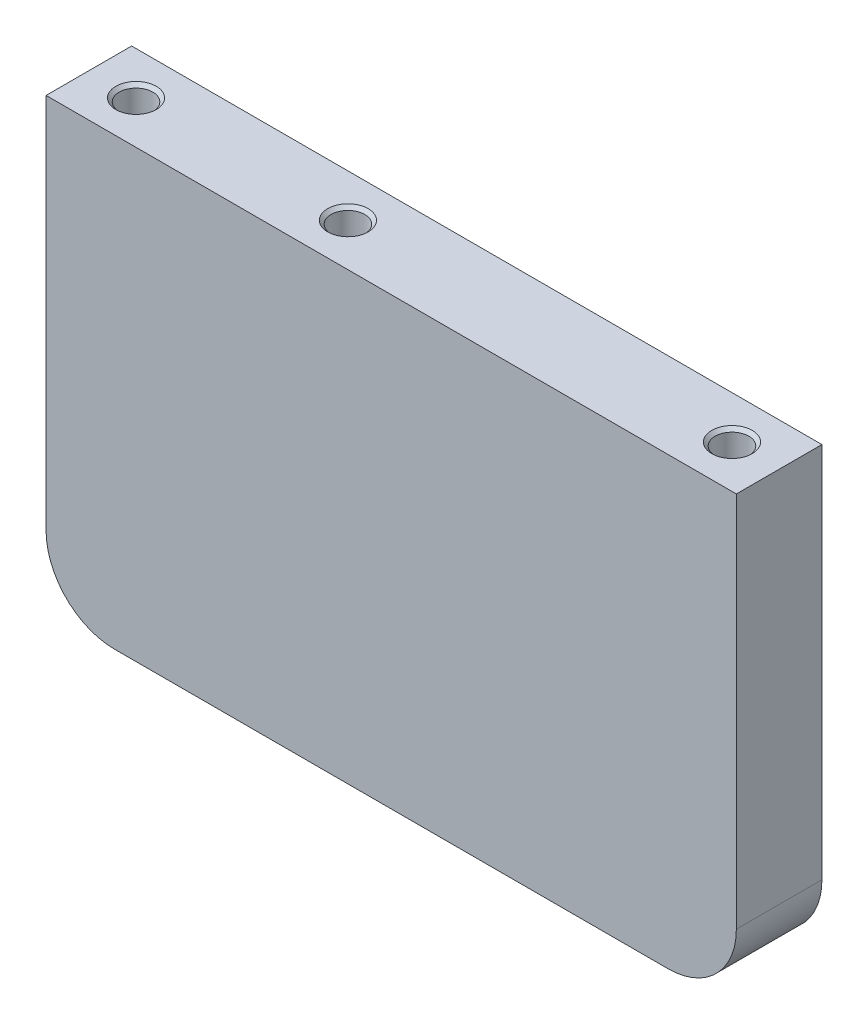
ISO-10303-21;
HEADER;
FILE_DESCRIPTION(('STEP AP214'),'2;1');
FILE_NAME('part.step','',(''),(''),'','','');
FILE_SCHEMA(('AUTOMOTIVE_DESIGN { 1 0 10303 214 1 1 1 1 }'));
ENDSEC;
DATA;
#1=APPLICATION_CONTEXT('core data for automotive mechanical design processes');
#2=APPLICATION_PROTOCOL_DEFINITION('international standard','automotive_design',2000,#1);
#3=PRODUCT_CONTEXT('',#1,'mechanical');
#4=PRODUCT('Part','Part','',(#3));
#5=PRODUCT_RELATED_PRODUCT_CATEGORY('part','',(#4));
#6=PRODUCT_DEFINITION_FORMATION('','',#4);
#7=PRODUCT_DEFINITION_CONTEXT('part definition',#1,'design');
#8=PRODUCT_DEFINITION('design','',#6,#7);
#9=PRODUCT_DEFINITION_SHAPE('','',#8);
#10=(LENGTH_UNIT() NAMED_UNIT(*) SI_UNIT(.MILLI.,.METRE.));
#11=(NAMED_UNIT(*) PLANE_ANGLE_UNIT() SI_UNIT($,.RADIAN.));
#12=(NAMED_UNIT(*) SI_UNIT($,.STERADIAN.) SOLID_ANGLE_UNIT());
#13=UNCERTAINTY_MEASURE_WITH_UNIT(LENGTH_MEASURE(1.E-05),#10,'distance_accuracy_value','');
#14=(GEOMETRIC_REPRESENTATION_CONTEXT(3) GLOBAL_UNCERTAINTY_ASSIGNED_CONTEXT((#13)) GLOBAL_UNIT_ASSIGNED_CONTEXT((#10,
#11,#12)) REPRESENTATION_CONTEXT('',''));
#15=CARTESIAN_POINT('',(0.,0.,0.));
#16=DIRECTION('',(0.,0.,1.));
#17=DIRECTION('',(1.,0.,0.));
#18=AXIS2_PLACEMENT_3D('',#15,#16,#17);
#19=CARTESIAN_POINT('',(-33.225,19.05,-6.35));
#20=DIRECTION('',(-1.,0.,0.));
#21=DIRECTION('',(0.,-1.,0.));
#22=AXIS2_PLACEMENT_3D('',#19,#20,#21);
#23=PLANE('',#22);
#24=DIRECTION('',(0.,-1.,0.));
#25=VECTOR('',#24,1.);
#26=CARTESIAN_POINT('',(-33.225,19.05,-6.35));
#27=LINE('',#26,#25);
#28=CARTESIAN_POINT('',(-33.225,19.05,-6.35));
#29=VERTEX_POINT('',#28);
#30=CARTESIAN_POINT('',(-33.225,-8.92,-6.35));
#31=VERTEX_POINT('',#30);
#32=EDGE_CURVE('E110',#29,#31,#27,.T.);
#33=ORIENTED_EDGE('',*,*,#32,.T.);
#34=DIRECTION('',(0.,0.,1.));
#35=VECTOR('',#34,1.);
#36=CARTESIAN_POINT('',(-33.225,-8.92,-6.35));
#37=LINE('',#36,#35);
#38=CARTESIAN_POINT('',(-33.225,-8.92,0.));
#39=VERTEX_POINT('',#38);
#40=EDGE_CURVE('E138',#31,#39,#37,.T.);
#41=ORIENTED_EDGE('',*,*,#40,.T.);
#42=DIRECTION('',(0.,-1.,0.));
#43=VECTOR('',#42,1.);
#44=CARTESIAN_POINT('',(-33.225,19.05,0.));
#45=LINE('',#44,#43);
#46=CARTESIAN_POINT('',(-33.225,19.05,0.));
#47=VERTEX_POINT('',#46);
#48=EDGE_CURVE('E114',#47,#39,#45,.T.);
#49=ORIENTED_EDGE('',*,*,#48,.F.);
#50=DIRECTION('',(0.,0.,1.));
#51=VECTOR('',#50,1.);
#52=CARTESIAN_POINT('',(-33.225,19.05,-6.35));
#53=LINE('',#52,#51);
#54=EDGE_CURVE('E107',#29,#47,#53,.T.);
#55=ORIENTED_EDGE('',*,*,#54,.F.);
#56=EDGE_LOOP('',(#33,#41,#49,#55));
#57=FACE_BOUND('',#56,.T.);
#58=ADVANCED_FACE('F38',(#57),#23,.T.);
#59=CARTESIAN_POINT('',(-33.225,19.05,-6.35));
#60=DIRECTION('',(0.,1.,0.));
#61=DIRECTION('',(0.,0.,1.));
#62=AXIS2_PLACEMENT_3D('',#59,#60,#61);
#63=PLANE('',#62);
#64=CARTESIAN_POINT('',(14.5,19.05,-3.17500000000004));
#65=DIRECTION('',(0.,1.,0.));
#66=DIRECTION('',(0.,0.,1.));
#67=AXIS2_PLACEMENT_3D('',#64,#65,#66);
#68=CIRCLE('',#67,1.5);
#69=CARTESIAN_POINT('',(14.5,19.05,-1.67500000000004));
#70=VERTEX_POINT('',#69);
#71=EDGE_CURVE('E150',#70,#70,#68,.F.);
#72=ORIENTED_EDGE('',*,*,#71,.T.);
#73=EDGE_LOOP('',(#72));
#74=FACE_BOUND('',#73,.T.);
#75=CARTESIAN_POINT('',(-14.0000000000001,19.05,-3.17500000000004));
#76=DIRECTION('',(0.,1.,0.));
#77=DIRECTION('',(0.,0.,1.));
#78=AXIS2_PLACEMENT_3D('',#75,#76,#77);
#79=CIRCLE('',#78,1.5);
#80=CARTESIAN_POINT('',(-14.0000000000001,19.05,-1.67500000000004));
#81=VERTEX_POINT('',#80);
#82=EDGE_CURVE('E147',#81,#81,#79,.F.);
#83=ORIENTED_EDGE('',*,*,#82,.T.);
#84=EDGE_LOOP('',(#83));
#85=FACE_BOUND('',#84,.T.);
#86=CARTESIAN_POINT('',(-29.725,19.05,-3.17500000000004));
#87=DIRECTION('',(0.,1.,0.));
#88=DIRECTION('',(0.,0.,1.));
#89=AXIS2_PLACEMENT_3D('',#86,#87,#88);
#90=CIRCLE('',#89,1.5);
#91=CARTESIAN_POINT('',(-29.725,19.05,-1.67500000000004));
#92=VERTEX_POINT('',#91);
#93=EDGE_CURVE('E144',#92,#92,#90,.F.);
#94=ORIENTED_EDGE('',*,*,#93,.T.);
#95=EDGE_LOOP('',(#94));
#96=FACE_BOUND('',#95,.T.);
#97=DIRECTION('',(-1.,0.,0.));
#98=VECTOR('',#97,1.);
#99=CARTESIAN_POINT('',(-33.225,19.05,0.));
#100=LINE('',#99,#98);
#101=CARTESIAN_POINT('',(18.,19.05,0.));
#102=VERTEX_POINT('',#101);
#103=EDGE_CURVE('E106',#102,#47,#100,.T.);
#104=ORIENTED_EDGE('',*,*,#103,.F.);
#105=DIRECTION('',(0.,0.,1.));
#106=VECTOR('',#105,1.);
#107=CARTESIAN_POINT('',(18.,19.05,-6.35));
#108=LINE('',#107,#106);
#109=CARTESIAN_POINT('',(18.,19.05,-6.35));
#110=VERTEX_POINT('',#109);
#111=EDGE_CURVE('E95',#110,#102,#108,.T.);
#112=ORIENTED_EDGE('',*,*,#111,.F.);
#113=DIRECTION('',(-1.,0.,0.));
#114=VECTOR('',#113,1.);
#115=CARTESIAN_POINT('',(-33.225,19.05,-6.35));
#116=LINE('',#115,#114);
#117=EDGE_CURVE('E99',#110,#29,#116,.T.);
#118=ORIENTED_EDGE('',*,*,#117,.T.);
#119=ORIENTED_EDGE('',*,*,#54,.T.);
#120=EDGE_LOOP('',(#104,#112,#118,#119));
#121=FACE_BOUND('',#120,.T.);
#122=ADVANCED_FACE('F104',(#74,#85,#96,#121),#63,.T.);
#123=CARTESIAN_POINT('',(18.,19.05,-6.35));
#124=DIRECTION('',(1.,0.,0.));
#125=DIRECTION('',(0.,1.,0.));
#126=AXIS2_PLACEMENT_3D('',#123,#124,#125);
#127=PLANE('',#126);
#128=DIRECTION('',(0.,1.,0.));
#129=VECTOR('',#128,1.);
#130=CARTESIAN_POINT('',(18.,19.05,0.));
#131=LINE('',#130,#129);
#132=CARTESIAN_POINT('',(18.,-8.92,0.));
#133=VERTEX_POINT('',#132);
#134=EDGE_CURVE('E121',#133,#102,#131,.T.);
#135=ORIENTED_EDGE('',*,*,#134,.F.);
#136=DIRECTION('',(0.,0.,1.));
#137=VECTOR('',#136,1.);
#138=CARTESIAN_POINT('',(18.,-8.92,-6.35));
#139=LINE('',#138,#137);
#140=CARTESIAN_POINT('',(18.,-8.92,-6.35));
#141=VERTEX_POINT('',#140);
#142=EDGE_CURVE('E61',#133,#141,#139,.F.);
#143=ORIENTED_EDGE('',*,*,#142,.T.);
#144=DIRECTION('',(0.,1.,0.));
#145=VECTOR('',#144,1.);
#146=CARTESIAN_POINT('',(18.,19.05,-6.35));
#147=LINE('',#146,#145);
#148=EDGE_CURVE('E92',#141,#110,#147,.T.);
#149=ORIENTED_EDGE('',*,*,#148,.T.);
#150=ORIENTED_EDGE('',*,*,#111,.T.);
#151=EDGE_LOOP('',(#135,#143,#149,#150));
#152=FACE_BOUND('',#151,.T.);
#153=ADVANCED_FACE('F94',(#152),#127,.T.);
#154=CARTESIAN_POINT('',(-33.225,-14.,-6.35));
#155=DIRECTION('',(0.,-1.,0.));
#156=DIRECTION('',(0.,0.,-1.));
#157=AXIS2_PLACEMENT_3D('',#154,#155,#156);
#158=PLANE('',#157);
#159=DIRECTION('',(1.,0.,0.));
#160=VECTOR('',#159,1.);
#161=CARTESIAN_POINT('',(-33.225,-14.,-6.35));
#162=LINE('',#161,#160);
#163=CARTESIAN_POINT('',(-28.145,-14.,-6.35));
#164=VERTEX_POINT('',#163);
#165=CARTESIAN_POINT('',(12.92,-14.,-6.35));
#166=VERTEX_POINT('',#165);
#167=EDGE_CURVE('E100',#164,#166,#162,.T.);
#168=ORIENTED_EDGE('',*,*,#167,.T.);
#169=DIRECTION('',(0.,0.,1.));
#170=VECTOR('',#169,1.);
#171=CARTESIAN_POINT('',(12.92,-14.,-6.35));
#172=LINE('',#171,#170);
#173=CARTESIAN_POINT('',(12.92,-14.,0.));
#174=VERTEX_POINT('',#173);
#175=EDGE_CURVE('E127',#166,#174,#172,.T.);
#176=ORIENTED_EDGE('',*,*,#175,.T.);
#177=DIRECTION('',(1.,0.,0.));
#178=VECTOR('',#177,1.);
#179=CARTESIAN_POINT('',(-33.225,-14.,0.));
#180=LINE('',#179,#178);
#181=CARTESIAN_POINT('',(-28.145,-14.,0.));
#182=VERTEX_POINT('',#181);
#183=EDGE_CURVE('E117',#182,#174,#180,.T.);
#184=ORIENTED_EDGE('',*,*,#183,.F.);
#185=DIRECTION('',(0.,0.,1.));
#186=VECTOR('',#185,1.);
#187=CARTESIAN_POINT('',(-28.145,-14.,-6.35));
#188=LINE('',#187,#186);
#189=EDGE_CURVE('E124',#182,#164,#188,.F.);
#190=ORIENTED_EDGE('',*,*,#189,.T.);
#191=EDGE_LOOP('',(#168,#176,#184,#190));
#192=FACE_BOUND('',#191,.T.);
#193=ADVANCED_FACE('F181',(#192),#158,.T.);
#194=CARTESIAN_POINT('',(0.,0.,-6.35));
#195=DIRECTION('',(0.,0.,1.));
#196=DIRECTION('',(1.,0.,0.));
#197=AXIS2_PLACEMENT_3D('',#194,#195,#196);
#198=PLANE('',#197);
#199=CARTESIAN_POINT('',(-22.225,0.,-6.35));
#200=DIRECTION('',(0.,0.,-1.));
#201=DIRECTION('',(-1.,0.,0.));
#202=AXIS2_PLACEMENT_3D('',#199,#200,#201);
#203=CIRCLE('',#202,3.35);
#204=CARTESIAN_POINT('',(-25.575,0.,-6.35));
#205=VERTEX_POINT('',#204);
#206=EDGE_CURVE('E221',#205,#205,#203,.T.);
#207=ORIENTED_EDGE('',*,*,#206,.F.);
#208=EDGE_LOOP('',(#207));
#209=FACE_BOUND('',#208,.T.);
#210=CARTESIAN_POINT('',(0.,0.,-6.35));
#211=DIRECTION('',(0.,0.,-1.));
#212=DIRECTION('',(-1.,0.,0.));
#213=AXIS2_PLACEMENT_3D('',#210,#211,#212);
#214=CIRCLE('',#213,11.05);
#215=CARTESIAN_POINT('',(-11.05,0.,-6.35));
#216=VERTEX_POINT('',#215);
#217=EDGE_CURVE('E222',#216,#216,#214,.T.);
#218=ORIENTED_EDGE('',*,*,#217,.F.);
#219=EDGE_LOOP('',(#218));
#220=FACE_BOUND('',#219,.T.);
#221=ORIENTED_EDGE('',*,*,#148,.F.);
#222=CARTESIAN_POINT('',(12.92,-8.92,-6.35));
#223=DIRECTION('',(0.,0.,1.));
#224=DIRECTION('',(1.,0.,0.));
#225=AXIS2_PLACEMENT_3D('',#222,#223,#224);
#226=CIRCLE('',#225,5.08);
#227=EDGE_CURVE('E136',#141,#166,#226,.F.);
#228=ORIENTED_EDGE('',*,*,#227,.T.);
#229=ORIENTED_EDGE('',*,*,#167,.F.);
#230=CARTESIAN_POINT('',(-28.145,-8.92,-6.35));
#231=DIRECTION('',(0.,0.,1.));
#232=DIRECTION('',(1.,0.,0.));
#233=AXIS2_PLACEMENT_3D('',#230,#231,#232);
#234=CIRCLE('',#233,5.08);
#235=EDGE_CURVE('E53',#164,#31,#234,.F.);
#236=ORIENTED_EDGE('',*,*,#235,.T.);
#237=ORIENTED_EDGE('',*,*,#32,.F.);
#238=ORIENTED_EDGE('',*,*,#117,.F.);
#239=EDGE_LOOP('',(#221,#228,#229,#236,#237,#238));
#240=FACE_BOUND('',#239,.T.);
#241=ADVANCED_FACE('F109',(#209,#220,#240),#198,.F.);
#242=CARTESIAN_POINT('',(0.,0.,0.));
#243=DIRECTION('',(0.,0.,1.));
#244=DIRECTION('',(1.,0.,0.));
#245=AXIS2_PLACEMENT_3D('',#242,#243,#244);
#246=PLANE('',#245);
#247=ORIENTED_EDGE('',*,*,#183,.T.);
#248=CARTESIAN_POINT('',(12.92,-8.92,0.));
#249=DIRECTION('',(0.,0.,1.));
#250=DIRECTION('',(1.,0.,0.));
#251=AXIS2_PLACEMENT_3D('',#248,#249,#250);
#252=CIRCLE('',#251,5.08);
#253=EDGE_CURVE('E132',#174,#133,#252,.T.);
#254=ORIENTED_EDGE('',*,*,#253,.T.);
#255=ORIENTED_EDGE('',*,*,#134,.T.);
#256=ORIENTED_EDGE('',*,*,#103,.T.);
#257=ORIENTED_EDGE('',*,*,#48,.T.);
#258=CARTESIAN_POINT('',(-28.145,-8.92,0.));
#259=DIRECTION('',(0.,0.,1.));
#260=DIRECTION('',(1.,0.,0.));
#261=AXIS2_PLACEMENT_3D('',#258,#259,#260);
#262=CIRCLE('',#261,5.08);
#263=EDGE_CURVE('E130',#39,#182,#262,.T.);
#264=ORIENTED_EDGE('',*,*,#263,.T.);
#265=EDGE_LOOP('',(#247,#254,#255,#256,#257,#264));
#266=FACE_BOUND('',#265,.T.);
#267=ADVANCED_FACE('F202',(#266),#246,.T.);
#268=CARTESIAN_POINT('',(14.5,4.05,-3.17500000000004));
#269=DIRECTION('',(0.,1.,0.));
#270=DIRECTION('',(0.,0.,1.));
#271=AXIS2_PLACEMENT_3D('',#268,#269,#270);
#272=CYLINDRICAL_SURFACE('',#271,1.25);
#273=CARTESIAN_POINT('',(14.5,18.8,-3.17500000000004));
#274=DIRECTION('',(0.,1.,0.));
#275=DIRECTION('',(0.,0.,1.));
#276=AXIS2_PLACEMENT_3D('',#273,#274,#275);
#277=CIRCLE('',#276,1.25);
#278=CARTESIAN_POINT('',(14.5,18.8,-1.92500000000004));
#279=VERTEX_POINT('',#278);
#280=EDGE_CURVE('E141',#279,#279,#277,.T.);
#281=ORIENTED_EDGE('',*,*,#280,.T.);
#282=EDGE_LOOP('',(#281));
#283=FACE_BOUND('',#282,.T.);
#284=CARTESIAN_POINT('',(14.5,4.05,-3.17500000000004));
#285=DIRECTION('',(0.,1.,0.));
#286=DIRECTION('',(0.,0.,1.));
#287=AXIS2_PLACEMENT_3D('',#284,#285,#286);
#288=CIRCLE('',#287,1.25);
#289=CARTESIAN_POINT('',(14.5,4.05,-1.92500000000004));
#290=VERTEX_POINT('',#289);
#291=EDGE_CURVE('E209',#290,#290,#288,.T.);
#292=ORIENTED_EDGE('',*,*,#291,.F.);
#293=EDGE_LOOP('',(#292));
#294=FACE_BOUND('',#293,.T.);
#295=ADVANCED_FACE('F265',(#283,#294),#272,.F.);
#296=CARTESIAN_POINT('',(14.5,4.05,-3.17500000000004));
#297=DIRECTION('',(0.,1.,0.));
#298=DIRECTION('',(0.,0.,1.));
#299=AXIS2_PLACEMENT_3D('',#296,#297,#298);
#300=PLANE('',#299);
#301=ORIENTED_EDGE('',*,*,#291,.T.);
#302=EDGE_LOOP('',(#301));
#303=FACE_BOUND('',#302,.T.);
#304=ADVANCED_FACE('F262',(#303),#300,.T.);
#305=CARTESIAN_POINT('',(-14.0000000000001,4.05,-3.17500000000004));
#306=DIRECTION('',(0.,1.,0.));
#307=DIRECTION('',(0.,0.,1.));
#308=AXIS2_PLACEMENT_3D('',#305,#306,#307);
#309=CYLINDRICAL_SURFACE('',#308,1.25);
#310=CARTESIAN_POINT('',(-14.0000000000001,18.8,-3.17500000000004));
#311=DIRECTION('',(0.,1.,0.));
#312=DIRECTION('',(0.,0.,1.));
#313=AXIS2_PLACEMENT_3D('',#310,#311,#312);
#314=CIRCLE('',#313,1.25);
#315=CARTESIAN_POINT('',(-14.0000000000001,18.8,-1.92500000000004));
#316=VERTEX_POINT('',#315);
#317=EDGE_CURVE('E46',#316,#316,#314,.T.);
#318=ORIENTED_EDGE('',*,*,#317,.T.);
#319=EDGE_LOOP('',(#318));
#320=FACE_BOUND('',#319,.T.);
#321=CARTESIAN_POINT('',(-14.0000000000001,4.05,-3.17500000000004));
#322=DIRECTION('',(0.,1.,0.));
#323=DIRECTION('',(0.,0.,1.));
#324=AXIS2_PLACEMENT_3D('',#321,#322,#323);
#325=CIRCLE('',#324,1.25);
#326=CARTESIAN_POINT('',(-14.0000000000001,4.05,-1.92500000000004));
#327=VERTEX_POINT('',#326);
#328=EDGE_CURVE('E212',#327,#327,#325,.T.);
#329=ORIENTED_EDGE('',*,*,#328,.F.);
#330=EDGE_LOOP('',(#329));
#331=FACE_BOUND('',#330,.T.);
#332=ADVANCED_FACE('F155',(#320,#331),#309,.F.);
#333=CARTESIAN_POINT('',(-14.0000000000001,4.05,-3.17500000000004));
#334=DIRECTION('',(0.,1.,0.));
#335=DIRECTION('',(0.,0.,1.));
#336=AXIS2_PLACEMENT_3D('',#333,#334,#335);
#337=PLANE('',#336);
#338=ORIENTED_EDGE('',*,*,#328,.T.);
#339=EDGE_LOOP('',(#338));
#340=FACE_BOUND('',#339,.T.);
#341=ADVANCED_FACE('F255',(#340),#337,.T.);
#342=CARTESIAN_POINT('',(-29.725,4.05,-3.17500000000004));
#343=DIRECTION('',(0.,1.,0.));
#344=DIRECTION('',(0.,0.,1.));
#345=AXIS2_PLACEMENT_3D('',#342,#343,#344);
#346=CYLINDRICAL_SURFACE('',#345,1.25);
#347=CARTESIAN_POINT('',(-29.725,18.8,-3.17500000000004));
#348=DIRECTION('',(0.,1.,0.));
#349=DIRECTION('',(0.,0.,1.));
#350=AXIS2_PLACEMENT_3D('',#347,#348,#349);
#351=CIRCLE('',#350,1.25);
#352=CARTESIAN_POINT('',(-29.725,18.8,-1.92500000000004));
#353=VERTEX_POINT('',#352);
#354=EDGE_CURVE('E12',#353,#353,#351,.T.);
#355=ORIENTED_EDGE('',*,*,#354,.T.);
#356=EDGE_LOOP('',(#355));
#357=FACE_BOUND('',#356,.T.);
#358=CARTESIAN_POINT('',(-29.725,4.05,-3.17500000000004));
#359=DIRECTION('',(0.,1.,0.));
#360=DIRECTION('',(0.,0.,1.));
#361=AXIS2_PLACEMENT_3D('',#358,#359,#360);
#362=CIRCLE('',#361,1.25);
#363=CARTESIAN_POINT('',(-29.725,4.05,-1.92500000000004));
#364=VERTEX_POINT('',#363);
#365=EDGE_CURVE('E118',#364,#364,#362,.T.);
#366=ORIENTED_EDGE('',*,*,#365,.F.);
#367=EDGE_LOOP('',(#366));
#368=FACE_BOUND('',#367,.T.);
#369=ADVANCED_FACE('F251',(#357,#368),#346,.F.);
#370=CARTESIAN_POINT('',(-29.725,4.05,-3.17500000000004));
#371=DIRECTION('',(0.,1.,0.));
#372=DIRECTION('',(0.,0.,1.));
#373=AXIS2_PLACEMENT_3D('',#370,#371,#372);
#374=PLANE('',#373);
#375=ORIENTED_EDGE('',*,*,#365,.T.);
#376=EDGE_LOOP('',(#375));
#377=FACE_BOUND('',#376,.T.);
#378=ADVANCED_FACE('F187',(#377),#374,.T.);
#379=CARTESIAN_POINT('',(12.92,-8.92,-6.35));
#380=DIRECTION('',(0.,0.,1.));
#381=DIRECTION('',(1.,0.,0.));
#382=AXIS2_PLACEMENT_3D('',#379,#380,#381);
#383=CYLINDRICAL_SURFACE('',#382,5.08);
#384=ORIENTED_EDGE('',*,*,#227,.F.);
#385=ORIENTED_EDGE('',*,*,#142,.F.);
#386=ORIENTED_EDGE('',*,*,#253,.F.);
#387=ORIENTED_EDGE('',*,*,#175,.F.);
#388=EDGE_LOOP('',(#384,#385,#386,#387));
#389=FACE_BOUND('',#388,.T.);
#390=ADVANCED_FACE('F183',(#389),#383,.T.);
#391=CARTESIAN_POINT('',(-28.145,-8.92,-6.35));
#392=DIRECTION('',(0.,0.,1.));
#393=DIRECTION('',(1.,0.,0.));
#394=AXIS2_PLACEMENT_3D('',#391,#392,#393);
#395=CYLINDRICAL_SURFACE('',#394,5.08);
#396=ORIENTED_EDGE('',*,*,#235,.F.);
#397=ORIENTED_EDGE('',*,*,#189,.F.);
#398=ORIENTED_EDGE('',*,*,#263,.F.);
#399=ORIENTED_EDGE('',*,*,#40,.F.);
#400=EDGE_LOOP('',(#396,#397,#398,#399));
#401=FACE_BOUND('',#400,.T.);
#402=ADVANCED_FACE('F186',(#401),#395,.T.);
#403=CARTESIAN_POINT('',(0.,0.,-1.5875));
#404=DIRECTION('',(0.,0.,1.));
#405=DIRECTION('',(1.,0.,0.));
#406=AXIS2_PLACEMENT_3D('',#403,#404,#405);
#407=PLANE('',#406);
#408=CARTESIAN_POINT('',(0.,0.,-1.5875));
#409=DIRECTION('',(0.,0.,1.));
#410=DIRECTION('',(1.,0.,0.));
#411=AXIS2_PLACEMENT_3D('',#408,#409,#410);
#412=CIRCLE('',#411,11.05);
#413=CARTESIAN_POINT('',(11.05,0.,-1.5875));
#414=VERTEX_POINT('',#413);
#415=EDGE_CURVE('E218',#414,#414,#412,.F.);
#416=ORIENTED_EDGE('',*,*,#415,.T.);
#417=EDGE_LOOP('',(#416));
#418=FACE_BOUND('',#417,.T.);
#419=ADVANCED_FACE('F190',(#418),#407,.F.);
#420=CARTESIAN_POINT('',(0.,0.,31.2541197284454));
#421=DIRECTION('',(0.,0.,-1.));
#422=DIRECTION('',(-1.,0.,0.));
#423=AXIS2_PLACEMENT_3D('',#420,#421,#422);
#424=CYLINDRICAL_SURFACE('',#423,11.05);
#425=ORIENTED_EDGE('',*,*,#217,.T.);
#426=EDGE_LOOP('',(#425));
#427=FACE_BOUND('',#426,.T.);
#428=ORIENTED_EDGE('',*,*,#415,.F.);
#429=EDGE_LOOP('',(#428));
#430=FACE_BOUND('',#429,.T.);
#431=ADVANCED_FACE('F195',(#427,#430),#424,.F.);
#432=CARTESIAN_POINT('',(0.,0.,-1.5875));
#433=DIRECTION('',(0.,0.,1.));
#434=DIRECTION('',(1.,0.,0.));
#435=AXIS2_PLACEMENT_3D('',#432,#433,#434);
#436=PLANE('',#435);
#437=CARTESIAN_POINT('',(-22.225,0.,-1.5875));
#438=DIRECTION('',(0.,0.,1.));
#439=DIRECTION('',(1.,0.,0.));
#440=AXIS2_PLACEMENT_3D('',#437,#438,#439);
#441=CIRCLE('',#440,3.35);
#442=CARTESIAN_POINT('',(-18.875,0.,-1.5875));
#443=VERTEX_POINT('',#442);
#444=EDGE_CURVE('E213',#443,#443,#441,.F.);
#445=ORIENTED_EDGE('',*,*,#444,.T.);
#446=EDGE_LOOP('',(#445));
#447=FACE_BOUND('',#446,.T.);
#448=ADVANCED_FACE('F239',(#447),#436,.F.);
#449=CARTESIAN_POINT('',(-22.225,0.,31.2541197284454));
#450=DIRECTION('',(0.,0.,-1.));
#451=DIRECTION('',(-1.,0.,0.));
#452=AXIS2_PLACEMENT_3D('',#449,#450,#451);
#453=CYLINDRICAL_SURFACE('',#452,3.35);
#454=ORIENTED_EDGE('',*,*,#206,.T.);
#455=EDGE_LOOP('',(#454));
#456=FACE_BOUND('',#455,.T.);
#457=ORIENTED_EDGE('',*,*,#444,.F.);
#458=EDGE_LOOP('',(#457));
#459=FACE_BOUND('',#458,.T.);
#460=ADVANCED_FACE('F167',(#456,#459),#453,.F.);
#461=CARTESIAN_POINT('',(14.5,18.8,-3.17500000000004));
#462=DIRECTION('',(0.,1.,0.));
#463=DIRECTION('',(0.,0.,1.));
#464=AXIS2_PLACEMENT_3D('',#461,#462,#463);
#465=CONICAL_SURFACE('',#464,1.25,0.785398163397455);
#466=ORIENTED_EDGE('',*,*,#71,.F.);
#467=EDGE_LOOP('',(#466));
#468=FACE_BOUND('',#467,.T.);
#469=ORIENTED_EDGE('',*,*,#280,.F.);
#470=EDGE_LOOP('',(#469));
#471=FACE_BOUND('',#470,.T.);
#472=ADVANCED_FACE('F160',(#468,#471),#465,.F.);
#473=CARTESIAN_POINT('',(-14.0000000000001,18.8,-3.17500000000004));
#474=DIRECTION('',(0.,1.,0.));
#475=DIRECTION('',(0.,0.,1.));
#476=AXIS2_PLACEMENT_3D('',#473,#474,#475);
#477=CONICAL_SURFACE('',#476,1.25,0.785398163397455);
#478=ORIENTED_EDGE('',*,*,#82,.F.);
#479=EDGE_LOOP('',(#478));
#480=FACE_BOUND('',#479,.T.);
#481=ORIENTED_EDGE('',*,*,#317,.F.);
#482=EDGE_LOOP('',(#481));
#483=FACE_BOUND('',#482,.T.);
#484=ADVANCED_FACE('F158',(#480,#483),#477,.F.);
#485=CARTESIAN_POINT('',(-29.725,18.8,-3.17500000000004));
#486=DIRECTION('',(0.,1.,0.));
#487=DIRECTION('',(0.,0.,1.));
#488=AXIS2_PLACEMENT_3D('',#485,#486,#487);
#489=CONICAL_SURFACE('',#488,1.25,0.785398163397455);
#490=ORIENTED_EDGE('',*,*,#93,.F.);
#491=EDGE_LOOP('',(#490));
#492=FACE_BOUND('',#491,.T.);
#493=ORIENTED_EDGE('',*,*,#354,.F.);
#494=EDGE_LOOP('',(#493));
#495=FACE_BOUND('',#494,.T.);
#496=ADVANCED_FACE('F40',(#492,#495),#489,.F.);
#497=CLOSED_SHELL('',(#58,#122,#153,#193,#241,#267,#295,#304,#332,#341,#369,#378,#390,#402,#419,
#431,#448,#460,#472,#484,#496));
#498=MANIFOLD_SOLID_BREP('B2',#497);
#499=ADVANCED_BREP_SHAPE_REPRESENTATION('',(#18,#498),#14);
#500=SHAPE_DEFINITION_REPRESENTATION(#9,#499);
ENDSEC;
END-ISO-10303-21;
